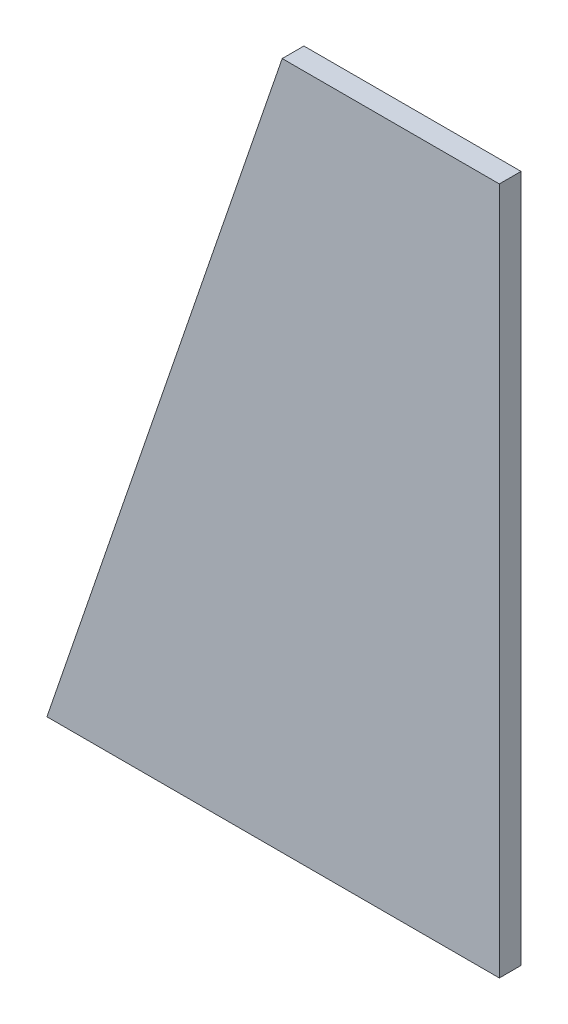
ISO-10303-21;
HEADER;
FILE_DESCRIPTION(('STEP AP214'),'2;1');
FILE_NAME('part.step','',(''),(''),'','','');
FILE_SCHEMA(('AUTOMOTIVE_DESIGN { 1 0 10303 214 1 1 1 1 }'));
ENDSEC;
DATA;
#1=APPLICATION_CONTEXT('core data for automotive mechanical design processes');
#2=APPLICATION_PROTOCOL_DEFINITION('international standard','automotive_design',2000,#1);
#3=PRODUCT_CONTEXT('',#1,'mechanical');
#4=PRODUCT('Part','Part','',(#3));
#5=PRODUCT_RELATED_PRODUCT_CATEGORY('part','',(#4));
#6=PRODUCT_DEFINITION_FORMATION('','',#4);
#7=PRODUCT_DEFINITION_CONTEXT('part definition',#1,'design');
#8=PRODUCT_DEFINITION('design','',#6,#7);
#9=PRODUCT_DEFINITION_SHAPE('','',#8);
#10=(LENGTH_UNIT() NAMED_UNIT(*) SI_UNIT(.MILLI.,.METRE.));
#11=(NAMED_UNIT(*) PLANE_ANGLE_UNIT() SI_UNIT($,.RADIAN.));
#12=(NAMED_UNIT(*) SI_UNIT($,.STERADIAN.) SOLID_ANGLE_UNIT());
#13=UNCERTAINTY_MEASURE_WITH_UNIT(LENGTH_MEASURE(1.E-05),#10,'distance_accuracy_value','');
#14=(GEOMETRIC_REPRESENTATION_CONTEXT(3) GLOBAL_UNCERTAINTY_ASSIGNED_CONTEXT((#13)) GLOBAL_UNIT_ASSIGNED_CONTEXT((#10,
#11,#12)) REPRESENTATION_CONTEXT('',''));
#15=CARTESIAN_POINT('',(0.,0.,0.));
#16=DIRECTION('',(0.,0.,1.));
#17=DIRECTION('',(1.,0.,0.));
#18=AXIS2_PLACEMENT_3D('',#15,#16,#17);
#19=CARTESIAN_POINT('',(0.,0.,3.));
#20=DIRECTION('',(0.946163984953356,-0.32368767906299,0.));
#21=DIRECTION('',(0.32368767906299,0.946163984953356,0.));
#22=AXIS2_PLACEMENT_3D('',#19,#20,#21);
#23=PLANE('',#22);
#24=DIRECTION('',(-0.32368767906299,-0.946163984953356,0.));
#25=VECTOR('',#24,1.);
#26=CARTESIAN_POINT('',(0.,0.,-3.));
#27=LINE('',#26,#25);
#28=CARTESIAN_POINT('',(65.,190.,-3.));
#29=VERTEX_POINT('',#28);
#30=CARTESIAN_POINT('',(0.,0.,-3.));
#31=VERTEX_POINT('',#30);
#32=EDGE_CURVE('E113',#29,#31,#27,.T.);
#33=ORIENTED_EDGE('',*,*,#32,.T.);
#34=DIRECTION('',(0.,0.,-1.));
#35=VECTOR('',#34,1.);
#36=CARTESIAN_POINT('',(0.,0.,3.));
#37=LINE('',#36,#35);
#38=CARTESIAN_POINT('',(0.,0.,3.));
#39=VERTEX_POINT('',#38);
#40=EDGE_CURVE('E11',#39,#31,#37,.T.);
#41=ORIENTED_EDGE('',*,*,#40,.F.);
#42=DIRECTION('',(-0.32368767906299,-0.946163984953356,0.));
#43=VECTOR('',#42,1.);
#44=CARTESIAN_POINT('',(0.,0.,3.));
#45=LINE('',#44,#43);
#46=CARTESIAN_POINT('',(65.,190.,3.));
#47=VERTEX_POINT('',#46);
#48=EDGE_CURVE('E95',#47,#39,#45,.T.);
#49=ORIENTED_EDGE('',*,*,#48,.F.);
#50=DIRECTION('',(0.,0.,-1.));
#51=VECTOR('',#50,1.);
#52=CARTESIAN_POINT('',(65.,190.,3.));
#53=LINE('',#52,#51);
#54=EDGE_CURVE('E62',#47,#29,#53,.T.);
#55=ORIENTED_EDGE('',*,*,#54,.T.);
#56=EDGE_LOOP('',(#33,#41,#49,#55));
#57=FACE_BOUND('',#56,.T.);
#58=ADVANCED_FACE('F45',(#57),#23,.F.);
#59=CARTESIAN_POINT('',(0.,0.,3.));
#60=DIRECTION('',(0.,1.,0.));
#61=DIRECTION('',(0.,0.,1.));
#62=AXIS2_PLACEMENT_3D('',#59,#60,#61);
#63=PLANE('',#62);
#64=DIRECTION('',(1.,0.,0.));
#65=VECTOR('',#64,1.);
#66=CARTESIAN_POINT('',(0.,0.,-3.));
#67=LINE('',#66,#65);
#68=CARTESIAN_POINT('',(125.,0.,-3.));
#69=VERTEX_POINT('',#68);
#70=EDGE_CURVE('E101',#31,#69,#67,.T.);
#71=ORIENTED_EDGE('',*,*,#70,.T.);
#72=DIRECTION('',(0.,0.,-1.));
#73=VECTOR('',#72,1.);
#74=CARTESIAN_POINT('',(125.,0.,3.));
#75=LINE('',#74,#73);
#76=CARTESIAN_POINT('',(125.,0.,3.));
#77=VERTEX_POINT('',#76);
#78=EDGE_CURVE('E54',#77,#69,#75,.T.);
#79=ORIENTED_EDGE('',*,*,#78,.F.);
#80=DIRECTION('',(1.,0.,0.));
#81=VECTOR('',#80,1.);
#82=CARTESIAN_POINT('',(0.,0.,3.));
#83=LINE('',#82,#81);
#84=EDGE_CURVE('E88',#39,#77,#83,.T.);
#85=ORIENTED_EDGE('',*,*,#84,.F.);
#86=ORIENTED_EDGE('',*,*,#40,.T.);
#87=EDGE_LOOP('',(#71,#79,#85,#86));
#88=FACE_BOUND('',#87,.T.);
#89=ADVANCED_FACE('F100',(#88),#63,.F.);
#90=CARTESIAN_POINT('',(125.,0.,3.));
#91=DIRECTION('',(-1.,0.,0.));
#92=DIRECTION('',(0.,0.,1.));
#93=AXIS2_PLACEMENT_3D('',#90,#91,#92);
#94=PLANE('',#93);
#95=DIRECTION('',(0.,1.,0.));
#96=VECTOR('',#95,1.);
#97=CARTESIAN_POINT('',(125.,0.,-3.));
#98=LINE('',#97,#96);
#99=CARTESIAN_POINT('',(125.,190.,-3.));
#100=VERTEX_POINT('',#99);
#101=EDGE_CURVE('E118',#69,#100,#98,.T.);
#102=ORIENTED_EDGE('',*,*,#101,.T.);
#103=DIRECTION('',(0.,0.,-1.));
#104=VECTOR('',#103,1.);
#105=CARTESIAN_POINT('',(125.,190.,3.));
#106=LINE('',#105,#104);
#107=CARTESIAN_POINT('',(125.,190.,3.));
#108=VERTEX_POINT('',#107);
#109=EDGE_CURVE('E77',#108,#100,#106,.T.);
#110=ORIENTED_EDGE('',*,*,#109,.F.);
#111=DIRECTION('',(0.,1.,0.));
#112=VECTOR('',#111,1.);
#113=CARTESIAN_POINT('',(125.,0.,3.));
#114=LINE('',#113,#112);
#115=EDGE_CURVE('E94',#77,#108,#114,.T.);
#116=ORIENTED_EDGE('',*,*,#115,.F.);
#117=ORIENTED_EDGE('',*,*,#78,.T.);
#118=EDGE_LOOP('',(#102,#110,#116,#117));
#119=FACE_BOUND('',#118,.T.);
#120=ADVANCED_FACE('F105',(#119),#94,.F.);
#121=CARTESIAN_POINT('',(0.,190.,3.));
#122=DIRECTION('',(0.,1.,0.));
#123=DIRECTION('',(0.,0.,1.));
#124=AXIS2_PLACEMENT_3D('',#121,#122,#123);
#125=PLANE('',#124);
#126=DIRECTION('',(1.,0.,0.));
#127=VECTOR('',#126,1.);
#128=CARTESIAN_POINT('',(0.,190.,-3.));
#129=LINE('',#128,#127);
#130=EDGE_CURVE('E121',#29,#100,#129,.T.);
#131=ORIENTED_EDGE('',*,*,#130,.F.);
#132=ORIENTED_EDGE('',*,*,#54,.F.);
#133=DIRECTION('',(1.,0.,0.));
#134=VECTOR('',#133,1.);
#135=CARTESIAN_POINT('',(0.,190.,3.));
#136=LINE('',#135,#134);
#137=EDGE_CURVE('E107',#47,#108,#136,.T.);
#138=ORIENTED_EDGE('',*,*,#137,.T.);
#139=ORIENTED_EDGE('',*,*,#109,.T.);
#140=EDGE_LOOP('',(#131,#132,#138,#139));
#141=FACE_BOUND('',#140,.T.);
#142=ADVANCED_FACE('F131',(#141),#125,.T.);
#143=CARTESIAN_POINT('',(0.,0.,3.));
#144=DIRECTION('',(0.,0.,1.));
#145=DIRECTION('',(1.,0.,0.));
#146=AXIS2_PLACEMENT_3D('',#143,#144,#145);
#147=PLANE('',#146);
#148=ORIENTED_EDGE('',*,*,#48,.T.);
#149=ORIENTED_EDGE('',*,*,#84,.T.);
#150=ORIENTED_EDGE('',*,*,#115,.T.);
#151=ORIENTED_EDGE('',*,*,#137,.F.);
#152=EDGE_LOOP('',(#148,#149,#150,#151));
#153=FACE_BOUND('',#152,.T.);
#154=ADVANCED_FACE('F91',(#153),#147,.T.);
#155=CARTESIAN_POINT('',(0.,0.,-3.));
#156=DIRECTION('',(0.,0.,1.));
#157=DIRECTION('',(1.,0.,0.));
#158=AXIS2_PLACEMENT_3D('',#155,#156,#157);
#159=PLANE('',#158);
#160=ORIENTED_EDGE('',*,*,#32,.F.);
#161=ORIENTED_EDGE('',*,*,#130,.T.);
#162=ORIENTED_EDGE('',*,*,#101,.F.);
#163=ORIENTED_EDGE('',*,*,#70,.F.);
#164=EDGE_LOOP('',(#160,#161,#162,#163));
#165=FACE_BOUND('',#164,.T.);
#166=ADVANCED_FACE('F130',(#165),#159,.F.);
#167=CLOSED_SHELL('',(#58,#89,#120,#142,#154,#166));
#168=MANIFOLD_SOLID_BREP('B2',#167);
#169=ADVANCED_BREP_SHAPE_REPRESENTATION('',(#18,#168),#14);
#170=SHAPE_DEFINITION_REPRESENTATION(#9,#169);
ENDSEC;
END-ISO-10303-21;
